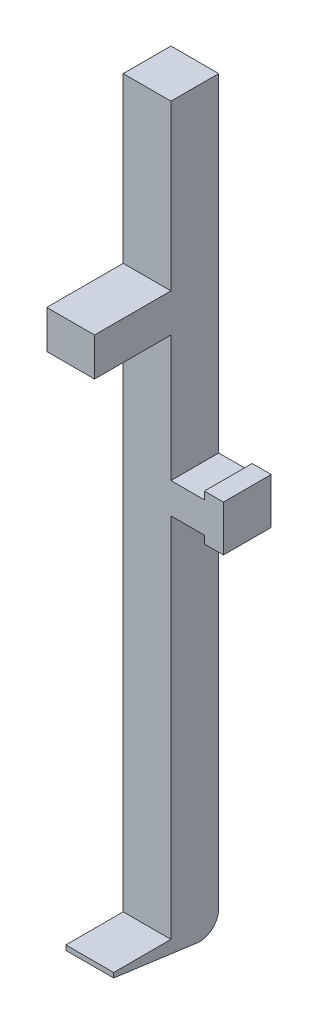
ISO-10303-21;
HEADER;
FILE_DESCRIPTION(('STEP AP214'),'2;1');
FILE_NAME('part.step','',(''),(''),'','','');
FILE_SCHEMA(('AUTOMOTIVE_DESIGN { 1 0 10303 214 1 1 1 1 }'));
ENDSEC;
DATA;
#1=APPLICATION_CONTEXT('core data for automotive mechanical design processes');
#2=APPLICATION_PROTOCOL_DEFINITION('international standard','automotive_design',2000,#1);
#3=PRODUCT_CONTEXT('',#1,'mechanical');
#4=PRODUCT('Part','Part','',(#3));
#5=PRODUCT_RELATED_PRODUCT_CATEGORY('part','',(#4));
#6=PRODUCT_DEFINITION_FORMATION('','',#4);
#7=PRODUCT_DEFINITION_CONTEXT('part definition',#1,'design');
#8=PRODUCT_DEFINITION('design','',#6,#7);
#9=PRODUCT_DEFINITION_SHAPE('','',#8);
#10=(LENGTH_UNIT() NAMED_UNIT(*) SI_UNIT(.MILLI.,.METRE.));
#11=(NAMED_UNIT(*) PLANE_ANGLE_UNIT() SI_UNIT($,.RADIAN.));
#12=(NAMED_UNIT(*) SI_UNIT($,.STERADIAN.) SOLID_ANGLE_UNIT());
#13=UNCERTAINTY_MEASURE_WITH_UNIT(LENGTH_MEASURE(1.E-05),#10,'distance_accuracy_value','');
#14=(GEOMETRIC_REPRESENTATION_CONTEXT(3) GLOBAL_UNCERTAINTY_ASSIGNED_CONTEXT((#13)) GLOBAL_UNIT_ASSIGNED_CONTEXT((#10,
#11,#12)) REPRESENTATION_CONTEXT('',''));
#15=CARTESIAN_POINT('',(0.,0.,0.));
#16=DIRECTION('',(0.,0.,1.));
#17=DIRECTION('',(1.,0.,0.));
#18=AXIS2_PLACEMENT_3D('',#15,#16,#17);
#19=CARTESIAN_POINT('',(-1.25,39.,1.25));
#20=DIRECTION('',(0.,0.,-1.));
#21=DIRECTION('',(-1.,0.,0.));
#22=AXIS2_PLACEMENT_3D('',#19,#20,#21);
#23=PLANE('',#22);
#24=DIRECTION('',(-1.,0.,0.));
#25=VECTOR('',#24,1.);
#26=CARTESIAN_POINT('',(1.25,30.4,1.25));
#27=LINE('',#26,#25);
#28=CARTESIAN_POINT('',(1.25,30.4,1.25));
#29=VERTEX_POINT('',#28);
#30=CARTESIAN_POINT('',(-1.25,30.4,1.25));
#31=VERTEX_POINT('',#30);
#32=EDGE_CURVE('E61',#29,#31,#27,.T.);
#33=ORIENTED_EDGE('',*,*,#32,.F.);
#34=DIRECTION('',(0.,-1.,0.));
#35=VECTOR('',#34,1.);
#36=CARTESIAN_POINT('',(1.25,39.,1.25));
#37=LINE('',#36,#35);
#38=CARTESIAN_POINT('',(1.25,39.,1.25));
#39=VERTEX_POINT('',#38);
#40=EDGE_CURVE('E203',#39,#29,#37,.T.);
#41=ORIENTED_EDGE('',*,*,#40,.F.);
#42=DIRECTION('',(1.,0.,0.));
#43=VECTOR('',#42,1.);
#44=CARTESIAN_POINT('',(-1.25,39.,1.25));
#45=LINE('',#44,#43);
#46=CARTESIAN_POINT('',(-1.25,39.,1.25));
#47=VERTEX_POINT('',#46);
#48=EDGE_CURVE('E331',#47,#39,#45,.T.);
#49=ORIENTED_EDGE('',*,*,#48,.F.);
#50=DIRECTION('',(0.,-1.,0.));
#51=VECTOR('',#50,1.);
#52=CARTESIAN_POINT('',(-1.25,39.,1.25));
#53=LINE('',#52,#51);
#54=EDGE_CURVE('E339',#47,#31,#53,.T.);
#55=ORIENTED_EDGE('',*,*,#54,.T.);
#56=EDGE_LOOP('',(#33,#41,#49,#55));
#57=FACE_BOUND('',#56,.T.);
#58=ADVANCED_FACE('F45',(#57),#23,.F.);
#59=DIRECTION('',(1.,0.,0.));
#60=VECTOR('',#59,1.);
#61=CARTESIAN_POINT('',(1.25,28.4,1.25));
#62=LINE('',#61,#60);
#63=CARTESIAN_POINT('',(-1.25,28.4,1.25));
#64=VERTEX_POINT('',#63);
#65=CARTESIAN_POINT('',(1.25,28.4,1.25));
#66=VERTEX_POINT('',#65);
#67=EDGE_CURVE('E69',#64,#66,#62,.T.);
#68=ORIENTED_EDGE('',*,*,#67,.F.);
#69=CARTESIAN_POINT('',(-1.25,1.,1.25));
#70=VERTEX_POINT('',#69);
#71=EDGE_CURVE('E337',#64,#70,#53,.T.);
#72=ORIENTED_EDGE('',*,*,#71,.T.);
#73=DIRECTION('',(1.,0.,0.));
#74=VECTOR('',#73,1.);
#75=CARTESIAN_POINT('',(-1.25,1.,1.25));
#76=LINE('',#75,#74);
#77=CARTESIAN_POINT('',(1.25,1.,1.25));
#78=VERTEX_POINT('',#77);
#79=EDGE_CURVE('E299',#70,#78,#76,.T.);
#80=ORIENTED_EDGE('',*,*,#79,.T.);
#81=CARTESIAN_POINT('',(1.25,20.2,1.25));
#82=VERTEX_POINT('',#81);
#83=EDGE_CURVE('E334',#82,#78,#37,.T.);
#84=ORIENTED_EDGE('',*,*,#83,.F.);
#85=DIRECTION('',(1.,0.,0.));
#86=VECTOR('',#85,1.);
#87=CARTESIAN_POINT('',(1.25,20.2,1.25));
#88=LINE('',#87,#86);
#89=CARTESIAN_POINT('',(3.,20.2,1.25));
#90=VERTEX_POINT('',#89);
#91=EDGE_CURVE('E219',#82,#90,#88,.T.);
#92=ORIENTED_EDGE('',*,*,#91,.T.);
#93=DIRECTION('',(0.,-1.,0.));
#94=VECTOR('',#93,1.);
#95=CARTESIAN_POINT('',(3.,20.2,1.25));
#96=LINE('',#95,#94);
#97=CARTESIAN_POINT('',(3.,19.8,1.25));
#98=VERTEX_POINT('',#97);
#99=EDGE_CURVE('E254',#90,#98,#96,.T.);
#100=ORIENTED_EDGE('',*,*,#99,.T.);
#101=DIRECTION('',(1.,0.,0.));
#102=VECTOR('',#101,1.);
#103=CARTESIAN_POINT('',(3.,19.8,1.25));
#104=LINE('',#103,#102);
#105=CARTESIAN_POINT('',(4.,19.8,1.25));
#106=VERTEX_POINT('',#105);
#107=EDGE_CURVE('E250',#98,#106,#104,.T.);
#108=ORIENTED_EDGE('',*,*,#107,.T.);
#109=DIRECTION('',(0.,-1.,0.));
#110=VECTOR('',#109,1.);
#111=CARTESIAN_POINT('',(4.,22.2,1.25));
#112=LINE('',#111,#110);
#113=CARTESIAN_POINT('',(4.,22.2,1.25));
#114=VERTEX_POINT('',#113);
#115=EDGE_CURVE('E246',#114,#106,#112,.T.);
#116=ORIENTED_EDGE('',*,*,#115,.F.);
#117=DIRECTION('',(1.,0.,0.));
#118=VECTOR('',#117,1.);
#119=CARTESIAN_POINT('',(3.,22.2,1.25));
#120=LINE('',#119,#118);
#121=CARTESIAN_POINT('',(3.,22.2,1.25));
#122=VERTEX_POINT('',#121);
#123=EDGE_CURVE('E243',#122,#114,#120,.T.);
#124=ORIENTED_EDGE('',*,*,#123,.F.);
#125=DIRECTION('',(0.,1.,0.));
#126=VECTOR('',#125,1.);
#127=CARTESIAN_POINT('',(3.,21.8,1.25));
#128=LINE('',#127,#126);
#129=CARTESIAN_POINT('',(3.,21.8,1.25));
#130=VERTEX_POINT('',#129);
#131=EDGE_CURVE('E209',#130,#122,#128,.T.);
#132=ORIENTED_EDGE('',*,*,#131,.F.);
#133=DIRECTION('',(1.,0.,0.));
#134=VECTOR('',#133,1.);
#135=CARTESIAN_POINT('',(1.25,21.8,1.25));
#136=LINE('',#135,#134);
#137=CARTESIAN_POINT('',(1.25,21.8,1.25));
#138=VERTEX_POINT('',#137);
#139=EDGE_CURVE('E205',#138,#130,#136,.T.);
#140=ORIENTED_EDGE('',*,*,#139,.F.);
#141=EDGE_CURVE('E338',#66,#138,#37,.T.);
#142=ORIENTED_EDGE('',*,*,#141,.F.);
#143=EDGE_LOOP('',(#68,#72,#80,#84,#92,#100,#108,#116,#124,#132,#140,#142));
#144=FACE_BOUND('',#143,.T.);
#145=ADVANCED_FACE('F423',(#144),#23,.F.);
#146=CARTESIAN_POINT('',(1.25,39.,1.25));
#147=DIRECTION('',(-1.,0.,0.));
#148=DIRECTION('',(0.,0.,1.));
#149=AXIS2_PLACEMENT_3D('',#146,#147,#148);
#150=PLANE('',#149);
#151=DIRECTION('',(0.,0.,1.));
#152=VECTOR('',#151,1.);
#153=CARTESIAN_POINT('',(1.25,21.8,-1.25));
#154=LINE('',#153,#152);
#155=CARTESIAN_POINT('',(1.25,21.8,-1.25));
#156=VERTEX_POINT('',#155);
#157=EDGE_CURVE('E285',#156,#138,#154,.T.);
#158=ORIENTED_EDGE('',*,*,#157,.F.);
#159=DIRECTION('',(0.,-1.,0.));
#160=VECTOR('',#159,1.);
#161=CARTESIAN_POINT('',(1.25,39.,-1.25));
#162=LINE('',#161,#160);
#163=CARTESIAN_POINT('',(1.25,39.,-1.25));
#164=VERTEX_POINT('',#163);
#165=EDGE_CURVE('E347',#164,#156,#162,.T.);
#166=ORIENTED_EDGE('',*,*,#165,.F.);
#167=DIRECTION('',(0.,0.,-1.));
#168=VECTOR('',#167,1.);
#169=CARTESIAN_POINT('',(1.25,39.,1.25));
#170=LINE('',#169,#168);
#171=EDGE_CURVE('E318',#39,#164,#170,.T.);
#172=ORIENTED_EDGE('',*,*,#171,.F.);
#173=ORIENTED_EDGE('',*,*,#40,.T.);
#174=DIRECTION('',(0.,0.,-1.));
#175=VECTOR('',#174,1.);
#176=CARTESIAN_POINT('',(1.25,30.4,5.25));
#177=LINE('',#176,#175);
#178=CARTESIAN_POINT('',(1.25,30.4,5.25));
#179=VERTEX_POINT('',#178);
#180=EDGE_CURVE('E182',#179,#29,#177,.T.);
#181=ORIENTED_EDGE('',*,*,#180,.F.);
#182=DIRECTION('',(0.,1.,0.));
#183=VECTOR('',#182,1.);
#184=CARTESIAN_POINT('',(1.25,30.4,5.25));
#185=LINE('',#184,#183);
#186=CARTESIAN_POINT('',(1.25,28.4,5.25));
#187=VERTEX_POINT('',#186);
#188=EDGE_CURVE('E189',#187,#179,#185,.T.);
#189=ORIENTED_EDGE('',*,*,#188,.F.);
#190=DIRECTION('',(0.,0.,-1.));
#191=VECTOR('',#190,1.);
#192=CARTESIAN_POINT('',(1.25,28.4,5.25));
#193=LINE('',#192,#191);
#194=EDGE_CURVE('E619',#187,#66,#193,.T.);
#195=ORIENTED_EDGE('',*,*,#194,.T.);
#196=ORIENTED_EDGE('',*,*,#141,.T.);
#197=EDGE_LOOP('',(#158,#166,#172,#173,#181,#189,#195,#196));
#198=FACE_BOUND('',#197,.T.);
#199=ADVANCED_FACE('F201',(#198),#150,.F.);
#200=CARTESIAN_POINT('',(1.25,20.2,-1.25));
#201=VERTEX_POINT('',#200);
#202=CARTESIAN_POINT('',(1.25,1.14561833232611,-1.25));
#203=VERTEX_POINT('',#202);
#204=EDGE_CURVE('E346',#201,#203,#162,.T.);
#205=ORIENTED_EDGE('',*,*,#204,.F.);
#206=DIRECTION('',(0.,0.,1.));
#207=VECTOR('',#206,1.);
#208=CARTESIAN_POINT('',(1.25,20.2,-1.25));
#209=LINE('',#208,#207);
#210=EDGE_CURVE('E239',#201,#82,#209,.T.);
#211=ORIENTED_EDGE('',*,*,#210,.T.);
#212=ORIENTED_EDGE('',*,*,#83,.T.);
#213=DIRECTION('',(0.,0.,-1.));
#214=VECTOR('',#213,1.);
#215=CARTESIAN_POINT('',(1.25,1.,4.25));
#216=LINE('',#215,#214);
#217=CARTESIAN_POINT('',(1.25,1.,4.25));
#218=VERTEX_POINT('',#217);
#219=EDGE_CURVE('E314',#218,#78,#216,.T.);
#220=ORIENTED_EDGE('',*,*,#219,.F.);
#221=DIRECTION('',(0.,1.,0.));
#222=VECTOR('',#221,1.);
#223=CARTESIAN_POINT('',(1.25,0.,4.25));
#224=LINE('',#223,#222);
#225=CARTESIAN_POINT('',(1.25,0.75,4.25));
#226=VERTEX_POINT('',#225);
#227=EDGE_CURVE('E307',#226,#218,#224,.T.);
#228=ORIENTED_EDGE('',*,*,#227,.F.);
#229=DIRECTION('',(0.,0.135113204733313,0.990830168044299));
#230=VECTOR('',#229,1.);
#231=CARTESIAN_POINT('',(1.25,0.75,4.25));
#232=LINE('',#231,#230);
#233=CARTESIAN_POINT('',(1.25,0.154788164281816,-0.114886795266687));
#234=VERTEX_POINT('',#233);
#235=EDGE_CURVE('E289',#234,#226,#232,.T.);
#236=ORIENTED_EDGE('',*,*,#235,.F.);
#237=CARTESIAN_POINT('',(1.25,1.14561833232611,-0.25));
#238=DIRECTION('',(-1.,0.,0.));
#239=DIRECTION('',(0.,0.,1.));
#240=AXIS2_PLACEMENT_3D('',#237,#238,#239);
#241=CIRCLE('',#240,1.);
#242=EDGE_CURVE('E11',#234,#203,#241,.F.);
#243=ORIENTED_EDGE('',*,*,#242,.T.);
#244=EDGE_LOOP('',(#205,#211,#212,#220,#228,#236,#243));
#245=FACE_BOUND('',#244,.T.);
#246=ADVANCED_FACE('F369',(#245),#150,.F.);
#247=CARTESIAN_POINT('',(-1.25,39.,-1.25));
#248=DIRECTION('',(0.,0.,1.));
#249=DIRECTION('',(1.,0.,0.));
#250=AXIS2_PLACEMENT_3D('',#247,#248,#249);
#251=PLANE('',#250);
#252=ORIENTED_EDGE('',*,*,#165,.T.);
#253=DIRECTION('',(1.,0.,0.));
#254=VECTOR('',#253,1.);
#255=CARTESIAN_POINT('',(1.25,21.8,-1.25));
#256=LINE('',#255,#254);
#257=CARTESIAN_POINT('',(3.,21.8,-1.25));
#258=VERTEX_POINT('',#257);
#259=EDGE_CURVE('E215',#156,#258,#256,.T.);
#260=ORIENTED_EDGE('',*,*,#259,.T.);
#261=DIRECTION('',(0.,1.,0.));
#262=VECTOR('',#261,1.);
#263=CARTESIAN_POINT('',(3.,21.8,-1.25));
#264=LINE('',#263,#262);
#265=CARTESIAN_POINT('',(3.,22.2,-1.25));
#266=VERTEX_POINT('',#265);
#267=EDGE_CURVE('E218',#258,#266,#264,.T.);
#268=ORIENTED_EDGE('',*,*,#267,.T.);
#269=DIRECTION('',(1.,0.,0.));
#270=VECTOR('',#269,1.);
#271=CARTESIAN_POINT('',(3.,22.2,-1.25));
#272=LINE('',#271,#270);
#273=CARTESIAN_POINT('',(4.,22.2,-1.25));
#274=VERTEX_POINT('',#273);
#275=EDGE_CURVE('E222',#266,#274,#272,.T.);
#276=ORIENTED_EDGE('',*,*,#275,.T.);
#277=DIRECTION('',(0.,-1.,0.));
#278=VECTOR('',#277,1.);
#279=CARTESIAN_POINT('',(4.,22.2,-1.25));
#280=LINE('',#279,#278);
#281=CARTESIAN_POINT('',(4.,19.8,-1.25));
#282=VERTEX_POINT('',#281);
#283=EDGE_CURVE('E225',#274,#282,#280,.T.);
#284=ORIENTED_EDGE('',*,*,#283,.T.);
#285=DIRECTION('',(1.,0.,0.));
#286=VECTOR('',#285,1.);
#287=CARTESIAN_POINT('',(3.,19.8,-1.25));
#288=LINE('',#287,#286);
#289=CARTESIAN_POINT('',(3.,19.8,-1.25));
#290=VERTEX_POINT('',#289);
#291=EDGE_CURVE('E228',#290,#282,#288,.T.);
#292=ORIENTED_EDGE('',*,*,#291,.F.);
#293=DIRECTION('',(0.,-1.,0.));
#294=VECTOR('',#293,1.);
#295=CARTESIAN_POINT('',(3.,20.2,-1.25));
#296=LINE('',#295,#294);
#297=CARTESIAN_POINT('',(3.,20.2,-1.25));
#298=VERTEX_POINT('',#297);
#299=EDGE_CURVE('E232',#298,#290,#296,.T.);
#300=ORIENTED_EDGE('',*,*,#299,.F.);
#301=DIRECTION('',(1.,0.,0.));
#302=VECTOR('',#301,1.);
#303=CARTESIAN_POINT('',(1.25,20.2,-1.25));
#304=LINE('',#303,#302);
#305=EDGE_CURVE('E236',#201,#298,#304,.T.);
#306=ORIENTED_EDGE('',*,*,#305,.F.);
#307=ORIENTED_EDGE('',*,*,#204,.T.);
#308=DIRECTION('',(-1.,0.,0.));
#309=VECTOR('',#308,1.);
#310=CARTESIAN_POINT('',(-1.25,1.14561833232611,-1.25));
#311=LINE('',#310,#309);
#312=CARTESIAN_POINT('',(-1.25,1.14561833232611,-1.25));
#313=VERTEX_POINT('',#312);
#314=EDGE_CURVE('E351',#203,#313,#311,.T.);
#315=ORIENTED_EDGE('',*,*,#314,.T.);
#316=DIRECTION('',(0.,-1.,0.));
#317=VECTOR('',#316,1.);
#318=CARTESIAN_POINT('',(-1.25,39.,-1.25));
#319=LINE('',#318,#317);
#320=CARTESIAN_POINT('',(-1.25,39.,-1.25));
#321=VERTEX_POINT('',#320);
#322=EDGE_CURVE('E342',#321,#313,#319,.T.);
#323=ORIENTED_EDGE('',*,*,#322,.F.);
#324=DIRECTION('',(-1.,0.,0.));
#325=VECTOR('',#324,1.);
#326=CARTESIAN_POINT('',(-1.25,39.,-1.25));
#327=LINE('',#326,#325);
#328=EDGE_CURVE('E325',#164,#321,#327,.T.);
#329=ORIENTED_EDGE('',*,*,#328,.F.);
#330=EDGE_LOOP('',(#252,#260,#268,#276,#284,#292,#300,#306,#307,#315,#323,#329));
#331=FACE_BOUND('',#330,.T.);
#332=ADVANCED_FACE('F374',(#331),#251,.F.);
#333=CARTESIAN_POINT('',(-1.25,39.,1.25));
#334=DIRECTION('',(1.,0.,0.));
#335=DIRECTION('',(0.,0.,-1.));
#336=AXIS2_PLACEMENT_3D('',#333,#334,#335);
#337=PLANE('',#336);
#338=ORIENTED_EDGE('',*,*,#322,.T.);
#339=CARTESIAN_POINT('',(-1.25,1.14561833232611,-0.25));
#340=DIRECTION('',(1.,0.,0.));
#341=DIRECTION('',(0.,0.,-1.));
#342=AXIS2_PLACEMENT_3D('',#339,#340,#341);
#343=CIRCLE('',#342,1.);
#344=CARTESIAN_POINT('',(-1.25,0.154788164281816,-0.114886795266687));
#345=VERTEX_POINT('',#344);
#346=EDGE_CURVE('E355',#313,#345,#343,.F.);
#347=ORIENTED_EDGE('',*,*,#346,.T.);
#348=DIRECTION('',(0.,0.135113204733313,0.990830168044299));
#349=VECTOR('',#348,1.);
#350=CARTESIAN_POINT('',(-1.25,0.75,4.25));
#351=LINE('',#350,#349);
#352=CARTESIAN_POINT('',(-1.25,0.75,4.25));
#353=VERTEX_POINT('',#352);
#354=EDGE_CURVE('E290',#345,#353,#351,.T.);
#355=ORIENTED_EDGE('',*,*,#354,.T.);
#356=DIRECTION('',(0.,1.,0.));
#357=VECTOR('',#356,1.);
#358=CARTESIAN_POINT('',(-1.25,0.,4.25));
#359=LINE('',#358,#357);
#360=CARTESIAN_POINT('',(-1.25,1.,4.25));
#361=VERTEX_POINT('',#360);
#362=EDGE_CURVE('E300',#353,#361,#359,.T.);
#363=ORIENTED_EDGE('',*,*,#362,.T.);
#364=DIRECTION('',(0.,0.,-1.));
#365=VECTOR('',#364,1.);
#366=CARTESIAN_POINT('',(-1.25,1.,4.25));
#367=LINE('',#366,#365);
#368=EDGE_CURVE('E310',#361,#70,#367,.T.);
#369=ORIENTED_EDGE('',*,*,#368,.T.);
#370=ORIENTED_EDGE('',*,*,#71,.F.);
#371=DIRECTION('',(0.,0.,-1.));
#372=VECTOR('',#371,1.);
#373=CARTESIAN_POINT('',(-1.25,28.4,5.25));
#374=LINE('',#373,#372);
#375=CARTESIAN_POINT('',(-1.25,28.4,5.25));
#376=VERTEX_POINT('',#375);
#377=EDGE_CURVE('E211',#376,#64,#374,.T.);
#378=ORIENTED_EDGE('',*,*,#377,.F.);
#379=DIRECTION('',(0.,-1.,0.));
#380=VECTOR('',#379,1.);
#381=CARTESIAN_POINT('',(-1.25,30.4,5.25));
#382=LINE('',#381,#380);
#383=CARTESIAN_POINT('',(-1.25,30.4,5.25));
#384=VERTEX_POINT('',#383);
#385=EDGE_CURVE('E188',#384,#376,#382,.T.);
#386=ORIENTED_EDGE('',*,*,#385,.F.);
#387=DIRECTION('',(0.,0.,-1.));
#388=VECTOR('',#387,1.);
#389=CARTESIAN_POINT('',(-1.25,30.4,5.25));
#390=LINE('',#389,#388);
#391=EDGE_CURVE('E184',#384,#31,#390,.T.);
#392=ORIENTED_EDGE('',*,*,#391,.T.);
#393=ORIENTED_EDGE('',*,*,#54,.F.);
#394=DIRECTION('',(0.,0.,1.));
#395=VECTOR('',#394,1.);
#396=CARTESIAN_POINT('',(-1.25,39.,1.25));
#397=LINE('',#396,#395);
#398=EDGE_CURVE('E328',#321,#47,#397,.T.);
#399=ORIENTED_EDGE('',*,*,#398,.F.);
#400=EDGE_LOOP('',(#338,#347,#355,#363,#369,#370,#378,#386,#392,#393,#399));
#401=FACE_BOUND('',#400,.T.);
#402=ADVANCED_FACE('F378',(#401),#337,.F.);
#403=CARTESIAN_POINT('',(0.,39.,0.));
#404=DIRECTION('',(0.,-1.,0.));
#405=DIRECTION('',(0.,0.,-1.));
#406=AXIS2_PLACEMENT_3D('',#403,#404,#405);
#407=PLANE('',#406);
#408=ORIENTED_EDGE('',*,*,#171,.T.);
#409=ORIENTED_EDGE('',*,*,#328,.T.);
#410=ORIENTED_EDGE('',*,*,#398,.T.);
#411=ORIENTED_EDGE('',*,*,#48,.T.);
#412=EDGE_LOOP('',(#408,#409,#410,#411));
#413=FACE_BOUND('',#412,.T.);
#414=ADVANCED_FACE('F382',(#413),#407,.F.);
#415=CARTESIAN_POINT('',(-1.25,1.,4.25));
#416=DIRECTION('',(0.,1.,0.));
#417=DIRECTION('',(0.,0.,1.));
#418=AXIS2_PLACEMENT_3D('',#415,#416,#417);
#419=PLANE('',#418);
#420=ORIENTED_EDGE('',*,*,#79,.F.);
#421=ORIENTED_EDGE('',*,*,#368,.F.);
#422=DIRECTION('',(1.,0.,0.));
#423=VECTOR('',#422,1.);
#424=CARTESIAN_POINT('',(-1.25,1.,4.25));
#425=LINE('',#424,#423);
#426=EDGE_CURVE('E303',#361,#218,#425,.T.);
#427=ORIENTED_EDGE('',*,*,#426,.T.);
#428=ORIENTED_EDGE('',*,*,#219,.T.);
#429=EDGE_LOOP('',(#420,#421,#427,#428));
#430=FACE_BOUND('',#429,.T.);
#431=ADVANCED_FACE('F420',(#430),#419,.T.);
#432=CARTESIAN_POINT('',(0.,0.,4.25));
#433=DIRECTION('',(0.,0.,-1.));
#434=DIRECTION('',(-1.,0.,0.));
#435=AXIS2_PLACEMENT_3D('',#432,#433,#434);
#436=PLANE('',#435);
#437=ORIENTED_EDGE('',*,*,#362,.F.);
#438=DIRECTION('',(1.,0.,0.));
#439=VECTOR('',#438,1.);
#440=CARTESIAN_POINT('',(-1.25,0.75,4.25));
#441=LINE('',#440,#439);
#442=EDGE_CURVE('E293',#353,#226,#441,.T.);
#443=ORIENTED_EDGE('',*,*,#442,.T.);
#444=ORIENTED_EDGE('',*,*,#227,.T.);
#445=ORIENTED_EDGE('',*,*,#426,.F.);
#446=EDGE_LOOP('',(#437,#443,#444,#445));
#447=FACE_BOUND('',#446,.T.);
#448=ADVANCED_FACE('F428',(#447),#436,.F.);
#449=CARTESIAN_POINT('',(-1.25,0.75,4.25));
#450=DIRECTION('',(0.,0.990830168044299,-0.135113204733313));
#451=DIRECTION('',(0.,0.135113204733313,0.990830168044299));
#452=AXIS2_PLACEMENT_3D('',#449,#450,#451);
#453=PLANE('',#452);
#454=ORIENTED_EDGE('',*,*,#354,.F.);
#455=DIRECTION('',(-1.,0.,0.));
#456=VECTOR('',#455,1.);
#457=CARTESIAN_POINT('',(-1.25,0.154788164281816,-0.114886795266687));
#458=LINE('',#457,#456);
#459=EDGE_CURVE('E54',#345,#234,#458,.F.);
#460=ORIENTED_EDGE('',*,*,#459,.T.);
#461=ORIENTED_EDGE('',*,*,#235,.T.);
#462=ORIENTED_EDGE('',*,*,#442,.F.);
#463=EDGE_LOOP('',(#454,#460,#461,#462));
#464=FACE_BOUND('',#463,.T.);
#465=ADVANCED_FACE('F362',(#464),#453,.F.);
#466=CARTESIAN_POINT('',(-1.25,1.14561833232611,-0.25));
#467=DIRECTION('',(-1.,0.,0.));
#468=DIRECTION('',(0.,0.,1.));
#469=AXIS2_PLACEMENT_3D('',#466,#467,#468);
#470=CYLINDRICAL_SURFACE('',#469,1.);
#471=ORIENTED_EDGE('',*,*,#242,.F.);
#472=ORIENTED_EDGE('',*,*,#459,.F.);
#473=ORIENTED_EDGE('',*,*,#346,.F.);
#474=ORIENTED_EDGE('',*,*,#314,.F.);
#475=EDGE_LOOP('',(#471,#472,#473,#474));
#476=FACE_BOUND('',#475,.T.);
#477=ADVANCED_FACE('F47',(#476),#470,.T.);
#478=CARTESIAN_POINT('',(1.25,21.8,-1.25));
#479=DIRECTION('',(0.,-1.,0.));
#480=DIRECTION('',(0.,0.,-1.));
#481=AXIS2_PLACEMENT_3D('',#478,#479,#480);
#482=PLANE('',#481);
#483=ORIENTED_EDGE('',*,*,#139,.T.);
#484=DIRECTION('',(0.,0.,1.));
#485=VECTOR('',#484,1.);
#486=CARTESIAN_POINT('',(3.,21.8,-1.25));
#487=LINE('',#486,#485);
#488=EDGE_CURVE('E281',#258,#130,#487,.T.);
#489=ORIENTED_EDGE('',*,*,#488,.F.);
#490=ORIENTED_EDGE('',*,*,#259,.F.);
#491=ORIENTED_EDGE('',*,*,#157,.T.);
#492=EDGE_LOOP('',(#483,#489,#490,#491));
#493=FACE_BOUND('',#492,.T.);
#494=ADVANCED_FACE('F387',(#493),#482,.F.);
#495=CARTESIAN_POINT('',(3.,21.8,-1.25));
#496=DIRECTION('',(1.,0.,0.));
#497=DIRECTION('',(0.,0.,-1.));
#498=AXIS2_PLACEMENT_3D('',#495,#496,#497);
#499=PLANE('',#498);
#500=ORIENTED_EDGE('',*,*,#131,.T.);
#501=DIRECTION('',(0.,0.,1.));
#502=VECTOR('',#501,1.);
#503=CARTESIAN_POINT('',(3.,22.2,-1.25));
#504=LINE('',#503,#502);
#505=EDGE_CURVE('E277',#266,#122,#504,.T.);
#506=ORIENTED_EDGE('',*,*,#505,.F.);
#507=ORIENTED_EDGE('',*,*,#267,.F.);
#508=ORIENTED_EDGE('',*,*,#488,.T.);
#509=EDGE_LOOP('',(#500,#506,#507,#508));
#510=FACE_BOUND('',#509,.T.);
#511=ADVANCED_FACE('F392',(#510),#499,.F.);
#512=CARTESIAN_POINT('',(3.,22.2,-1.25));
#513=DIRECTION('',(0.,-1.,0.));
#514=DIRECTION('',(0.,0.,-1.));
#515=AXIS2_PLACEMENT_3D('',#512,#513,#514);
#516=PLANE('',#515);
#517=ORIENTED_EDGE('',*,*,#123,.T.);
#518=DIRECTION('',(0.,0.,1.));
#519=VECTOR('',#518,1.);
#520=CARTESIAN_POINT('',(4.,22.2,-1.25));
#521=LINE('',#520,#519);
#522=EDGE_CURVE('E273',#274,#114,#521,.T.);
#523=ORIENTED_EDGE('',*,*,#522,.F.);
#524=ORIENTED_EDGE('',*,*,#275,.F.);
#525=ORIENTED_EDGE('',*,*,#505,.T.);
#526=EDGE_LOOP('',(#517,#523,#524,#525));
#527=FACE_BOUND('',#526,.T.);
#528=ADVANCED_FACE('F399',(#527),#516,.F.);
#529=CARTESIAN_POINT('',(4.,22.2,-1.25));
#530=DIRECTION('',(-1.,0.,0.));
#531=DIRECTION('',(0.,-1.,0.));
#532=AXIS2_PLACEMENT_3D('',#529,#530,#531);
#533=PLANE('',#532);
#534=ORIENTED_EDGE('',*,*,#115,.T.);
#535=DIRECTION('',(0.,0.,1.));
#536=VECTOR('',#535,1.);
#537=CARTESIAN_POINT('',(4.,19.8,-1.25));
#538=LINE('',#537,#536);
#539=EDGE_CURVE('E270',#282,#106,#538,.T.);
#540=ORIENTED_EDGE('',*,*,#539,.F.);
#541=ORIENTED_EDGE('',*,*,#283,.F.);
#542=ORIENTED_EDGE('',*,*,#522,.T.);
#543=EDGE_LOOP('',(#534,#540,#541,#542));
#544=FACE_BOUND('',#543,.T.);
#545=ADVANCED_FACE('F403',(#544),#533,.F.);
#546=CARTESIAN_POINT('',(3.,19.8,-1.25));
#547=DIRECTION('',(0.,-1.,0.));
#548=DIRECTION('',(0.,0.,-1.));
#549=AXIS2_PLACEMENT_3D('',#546,#547,#548);
#550=PLANE('',#549);
#551=ORIENTED_EDGE('',*,*,#107,.F.);
#552=DIRECTION('',(0.,0.,1.));
#553=VECTOR('',#552,1.);
#554=CARTESIAN_POINT('',(3.,19.8,-1.25));
#555=LINE('',#554,#553);
#556=EDGE_CURVE('E267',#290,#98,#555,.T.);
#557=ORIENTED_EDGE('',*,*,#556,.F.);
#558=ORIENTED_EDGE('',*,*,#291,.T.);
#559=ORIENTED_EDGE('',*,*,#539,.T.);
#560=EDGE_LOOP('',(#551,#557,#558,#559));
#561=FACE_BOUND('',#560,.T.);
#562=ADVANCED_FACE('F406',(#561),#550,.T.);
#563=CARTESIAN_POINT('',(3.,20.2,-1.25));
#564=DIRECTION('',(-1.,0.,0.));
#565=DIRECTION('',(0.,0.,1.));
#566=AXIS2_PLACEMENT_3D('',#563,#564,#565);
#567=PLANE('',#566);
#568=ORIENTED_EDGE('',*,*,#99,.F.);
#569=DIRECTION('',(0.,0.,1.));
#570=VECTOR('',#569,1.);
#571=CARTESIAN_POINT('',(3.,20.2,-1.25));
#572=LINE('',#571,#570);
#573=EDGE_CURVE('E264',#298,#90,#572,.T.);
#574=ORIENTED_EDGE('',*,*,#573,.F.);
#575=ORIENTED_EDGE('',*,*,#299,.T.);
#576=ORIENTED_EDGE('',*,*,#556,.T.);
#577=EDGE_LOOP('',(#568,#574,#575,#576));
#578=FACE_BOUND('',#577,.T.);
#579=ADVANCED_FACE('F410',(#578),#567,.T.);
#580=CARTESIAN_POINT('',(1.25,20.2,-1.25));
#581=DIRECTION('',(0.,-1.,0.));
#582=DIRECTION('',(0.,0.,-1.));
#583=AXIS2_PLACEMENT_3D('',#580,#581,#582);
#584=PLANE('',#583);
#585=ORIENTED_EDGE('',*,*,#91,.F.);
#586=ORIENTED_EDGE('',*,*,#210,.F.);
#587=ORIENTED_EDGE('',*,*,#305,.T.);
#588=ORIENTED_EDGE('',*,*,#573,.T.);
#589=EDGE_LOOP('',(#585,#586,#587,#588));
#590=FACE_BOUND('',#589,.T.);
#591=ADVANCED_FACE('F412',(#590),#584,.T.);
#592=CARTESIAN_POINT('',(1.25,30.4,5.25));
#593=DIRECTION('',(0.,-1.,0.));
#594=DIRECTION('',(0.,0.,-1.));
#595=AXIS2_PLACEMENT_3D('',#592,#593,#594);
#596=PLANE('',#595);
#597=ORIENTED_EDGE('',*,*,#32,.T.);
#598=ORIENTED_EDGE('',*,*,#391,.F.);
#599=DIRECTION('',(-1.,0.,0.));
#600=VECTOR('',#599,1.);
#601=CARTESIAN_POINT('',(1.25,30.4,5.25));
#602=LINE('',#601,#600);
#603=EDGE_CURVE('E178',#179,#384,#602,.T.);
#604=ORIENTED_EDGE('',*,*,#603,.F.);
#605=ORIENTED_EDGE('',*,*,#180,.T.);
#606=EDGE_LOOP('',(#597,#598,#604,#605));
#607=FACE_BOUND('',#606,.T.);
#608=ADVANCED_FACE('F180',(#607),#596,.F.);
#609=CARTESIAN_POINT('',(1.25,28.4,5.25));
#610=DIRECTION('',(0.,1.,0.));
#611=DIRECTION('',(0.,0.,1.));
#612=AXIS2_PLACEMENT_3D('',#609,#610,#611);
#613=PLANE('',#612);
#614=ORIENTED_EDGE('',*,*,#67,.T.);
#615=ORIENTED_EDGE('',*,*,#194,.F.);
#616=DIRECTION('',(1.,0.,0.));
#617=VECTOR('',#616,1.);
#618=CARTESIAN_POINT('',(1.25,28.4,5.25));
#619=LINE('',#618,#617);
#620=EDGE_CURVE('E194',#376,#187,#619,.T.);
#621=ORIENTED_EDGE('',*,*,#620,.F.);
#622=ORIENTED_EDGE('',*,*,#377,.T.);
#623=EDGE_LOOP('',(#614,#615,#621,#622));
#624=FACE_BOUND('',#623,.T.);
#625=ADVANCED_FACE('F470',(#624),#613,.F.);
#626=CARTESIAN_POINT('',(0.,0.,5.25));
#627=DIRECTION('',(0.,0.,-1.));
#628=DIRECTION('',(-1.,0.,0.));
#629=AXIS2_PLACEMENT_3D('',#626,#627,#628);
#630=PLANE('',#629);
#631=ORIENTED_EDGE('',*,*,#188,.T.);
#632=ORIENTED_EDGE('',*,*,#603,.T.);
#633=ORIENTED_EDGE('',*,*,#385,.T.);
#634=ORIENTED_EDGE('',*,*,#620,.T.);
#635=EDGE_LOOP('',(#631,#632,#633,#634));
#636=FACE_BOUND('',#635,.T.);
#637=ADVANCED_FACE('F192',(#636),#630,.F.);
#638=CLOSED_SHELL('',(#58,#145,#199,#246,#332,#402,#414,#431,#448,#465,#477,#494,#511,#528,#545,
#562,#579,#591,#608,#625,#637));
#639=MANIFOLD_SOLID_BREP('B2',#638);
#640=ADVANCED_BREP_SHAPE_REPRESENTATION('',(#18,#639),#14);
#641=SHAPE_DEFINITION_REPRESENTATION(#9,#640);
ENDSEC;
END-ISO-10303-21;
